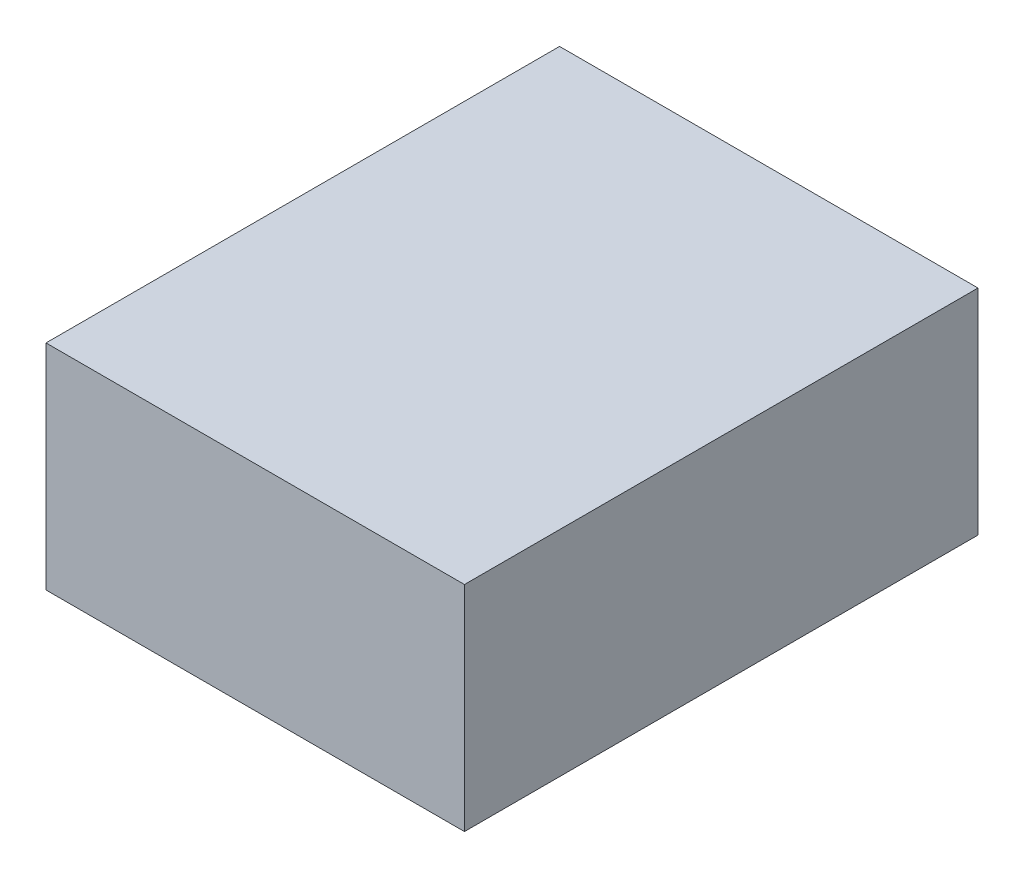
ISO-10303-21;
HEADER;
FILE_DESCRIPTION(('STEP AP214'),'2;1');
FILE_NAME('part.step','',(''),(''),'','','');
FILE_SCHEMA(('AUTOMOTIVE_DESIGN { 1 0 10303 214 1 1 1 1 }'));
ENDSEC;
DATA;
#1=APPLICATION_CONTEXT('core data for automotive mechanical design processes');
#2=APPLICATION_PROTOCOL_DEFINITION('international standard','automotive_design',2000,#1);
#3=PRODUCT_CONTEXT('',#1,'mechanical');
#4=PRODUCT('Part','Part','',(#3));
#5=PRODUCT_RELATED_PRODUCT_CATEGORY('part','',(#4));
#6=PRODUCT_DEFINITION_FORMATION('','',#4);
#7=PRODUCT_DEFINITION_CONTEXT('part definition',#1,'design');
#8=PRODUCT_DEFINITION('design','',#6,#7);
#9=PRODUCT_DEFINITION_SHAPE('','',#8);
#10=(LENGTH_UNIT() NAMED_UNIT(*) SI_UNIT(.MILLI.,.METRE.));
#11=(NAMED_UNIT(*) PLANE_ANGLE_UNIT() SI_UNIT($,.RADIAN.));
#12=(NAMED_UNIT(*) SI_UNIT($,.STERADIAN.) SOLID_ANGLE_UNIT());
#13=UNCERTAINTY_MEASURE_WITH_UNIT(LENGTH_MEASURE(1.E-05),#10,'distance_accuracy_value','');
#14=(GEOMETRIC_REPRESENTATION_CONTEXT(3) GLOBAL_UNCERTAINTY_ASSIGNED_CONTEXT((#13)) GLOBAL_UNIT_ASSIGNED_CONTEXT((#10,
#11,#12)) REPRESENTATION_CONTEXT('',''));
#15=CARTESIAN_POINT('',(0.,0.,0.));
#16=DIRECTION('',(0.,0.,1.));
#17=DIRECTION('',(1.,0.,0.));
#18=AXIS2_PLACEMENT_3D('',#15,#16,#17);
#19=CARTESIAN_POINT('',(352.,-90.,-216.));
#20=DIRECTION('',(0.,0.,1.));
#21=DIRECTION('',(1.,0.,0.));
#22=AXIS2_PLACEMENT_3D('',#19,#20,#21);
#23=PLANE('',#22);
#24=DIRECTION('',(0.,1.,0.));
#25=VECTOR('',#24,1.);
#26=CARTESIAN_POINT('',(0.,-90.,-216.));
#27=LINE('',#26,#25);
#28=CARTESIAN_POINT('',(0.,-90.,-216.));
#29=VERTEX_POINT('',#28);
#30=CARTESIAN_POINT('',(0.,90.,-216.));
#31=VERTEX_POINT('',#30);
#32=EDGE_CURVE('E102',#29,#31,#27,.T.);
#33=ORIENTED_EDGE('',*,*,#32,.T.);
#34=DIRECTION('',(-1.,0.,0.));
#35=VECTOR('',#34,1.);
#36=CARTESIAN_POINT('',(352.,90.,-216.));
#37=LINE('',#36,#35);
#38=CARTESIAN_POINT('',(352.,90.,-216.));
#39=VERTEX_POINT('',#38);
#40=EDGE_CURVE('E11',#39,#31,#37,.T.);
#41=ORIENTED_EDGE('',*,*,#40,.F.);
#42=DIRECTION('',(0.,1.,0.));
#43=VECTOR('',#42,1.);
#44=CARTESIAN_POINT('',(352.,-90.,-216.));
#45=LINE('',#44,#43);
#46=CARTESIAN_POINT('',(352.,-90.,-216.));
#47=VERTEX_POINT('',#46);
#48=EDGE_CURVE('E90',#47,#39,#45,.T.);
#49=ORIENTED_EDGE('',*,*,#48,.F.);
#50=DIRECTION('',(-1.,0.,0.));
#51=VECTOR('',#50,1.);
#52=CARTESIAN_POINT('',(352.,-90.,-216.));
#53=LINE('',#52,#51);
#54=EDGE_CURVE('E98',#47,#29,#53,.T.);
#55=ORIENTED_EDGE('',*,*,#54,.T.);
#56=EDGE_LOOP('',(#33,#41,#49,#55));
#57=FACE_BOUND('',#56,.T.);
#58=ADVANCED_FACE('F39',(#57),#23,.F.);
#59=CARTESIAN_POINT('',(352.,90.,216.));
#60=DIRECTION('',(0.,-1.,0.));
#61=DIRECTION('',(0.,0.,-1.));
#62=AXIS2_PLACEMENT_3D('',#59,#60,#61);
#63=PLANE('',#62);
#64=DIRECTION('',(0.,0.,1.));
#65=VECTOR('',#64,1.);
#66=CARTESIAN_POINT('',(0.,90.,216.));
#67=LINE('',#66,#65);
#68=CARTESIAN_POINT('',(0.,90.,216.));
#69=VERTEX_POINT('',#68);
#70=EDGE_CURVE('E94',#31,#69,#67,.T.);
#71=ORIENTED_EDGE('',*,*,#70,.T.);
#72=DIRECTION('',(-1.,0.,0.));
#73=VECTOR('',#72,1.);
#74=CARTESIAN_POINT('',(352.,90.,216.));
#75=LINE('',#74,#73);
#76=CARTESIAN_POINT('',(352.,90.,216.));
#77=VERTEX_POINT('',#76);
#78=EDGE_CURVE('E47',#77,#69,#75,.T.);
#79=ORIENTED_EDGE('',*,*,#78,.F.);
#80=DIRECTION('',(0.,0.,1.));
#81=VECTOR('',#80,1.);
#82=CARTESIAN_POINT('',(352.,90.,216.));
#83=LINE('',#82,#81);
#84=EDGE_CURVE('E85',#39,#77,#83,.T.);
#85=ORIENTED_EDGE('',*,*,#84,.F.);
#86=ORIENTED_EDGE('',*,*,#40,.T.);
#87=EDGE_LOOP('',(#71,#79,#85,#86));
#88=FACE_BOUND('',#87,.T.);
#89=ADVANCED_FACE('F93',(#88),#63,.F.);
#90=CARTESIAN_POINT('',(352.,-90.,216.));
#91=DIRECTION('',(0.,0.,-1.));
#92=DIRECTION('',(-1.,0.,0.));
#93=AXIS2_PLACEMENT_3D('',#90,#91,#92);
#94=PLANE('',#93);
#95=DIRECTION('',(0.,-1.,0.));
#96=VECTOR('',#95,1.);
#97=CARTESIAN_POINT('',(0.,-90.,216.));
#98=LINE('',#97,#96);
#99=CARTESIAN_POINT('',(0.,-90.,216.));
#100=VERTEX_POINT('',#99);
#101=EDGE_CURVE('E72',#69,#100,#98,.T.);
#102=ORIENTED_EDGE('',*,*,#101,.T.);
#103=DIRECTION('',(-1.,0.,0.));
#104=VECTOR('',#103,1.);
#105=CARTESIAN_POINT('',(352.,-90.,216.));
#106=LINE('',#105,#104);
#107=CARTESIAN_POINT('',(352.,-90.,216.));
#108=VERTEX_POINT('',#107);
#109=EDGE_CURVE('E95',#108,#100,#106,.T.);
#110=ORIENTED_EDGE('',*,*,#109,.F.);
#111=DIRECTION('',(0.,-1.,0.));
#112=VECTOR('',#111,1.);
#113=CARTESIAN_POINT('',(352.,-90.,216.));
#114=LINE('',#113,#112);
#115=EDGE_CURVE('E88',#77,#108,#114,.T.);
#116=ORIENTED_EDGE('',*,*,#115,.F.);
#117=ORIENTED_EDGE('',*,*,#78,.T.);
#118=EDGE_LOOP('',(#102,#110,#116,#117));
#119=FACE_BOUND('',#118,.T.);
#120=ADVANCED_FACE('F96',(#119),#94,.F.);
#121=CARTESIAN_POINT('',(352.,-90.,216.));
#122=DIRECTION('',(0.,1.,0.));
#123=DIRECTION('',(0.,0.,1.));
#124=AXIS2_PLACEMENT_3D('',#121,#122,#123);
#125=PLANE('',#124);
#126=DIRECTION('',(0.,0.,-1.));
#127=VECTOR('',#126,1.);
#128=CARTESIAN_POINT('',(0.,-90.,216.));
#129=LINE('',#128,#127);
#130=EDGE_CURVE('E78',#100,#29,#129,.T.);
#131=ORIENTED_EDGE('',*,*,#130,.T.);
#132=ORIENTED_EDGE('',*,*,#54,.F.);
#133=DIRECTION('',(0.,0.,-1.));
#134=VECTOR('',#133,1.);
#135=CARTESIAN_POINT('',(352.,-90.,216.));
#136=LINE('',#135,#134);
#137=EDGE_CURVE('E55',#108,#47,#136,.T.);
#138=ORIENTED_EDGE('',*,*,#137,.F.);
#139=ORIENTED_EDGE('',*,*,#109,.T.);
#140=EDGE_LOOP('',(#131,#132,#138,#139));
#141=FACE_BOUND('',#140,.T.);
#142=ADVANCED_FACE('F109',(#141),#125,.F.);
#143=CARTESIAN_POINT('',(352.,0.,0.));
#144=DIRECTION('',(-1.,0.,0.));
#145=DIRECTION('',(0.,0.,1.));
#146=AXIS2_PLACEMENT_3D('',#143,#144,#145);
#147=PLANE('',#146);
#148=ORIENTED_EDGE('',*,*,#48,.T.);
#149=ORIENTED_EDGE('',*,*,#84,.T.);
#150=ORIENTED_EDGE('',*,*,#115,.T.);
#151=ORIENTED_EDGE('',*,*,#137,.T.);
#152=EDGE_LOOP('',(#148,#149,#150,#151));
#153=FACE_BOUND('',#152,.T.);
#154=ADVANCED_FACE('F86',(#153),#147,.F.);
#155=CARTESIAN_POINT('',(0.,0.,0.));
#156=DIRECTION('',(-1.,0.,0.));
#157=DIRECTION('',(0.,0.,1.));
#158=AXIS2_PLACEMENT_3D('',#155,#156,#157);
#159=PLANE('',#158);
#160=ORIENTED_EDGE('',*,*,#32,.F.);
#161=ORIENTED_EDGE('',*,*,#130,.F.);
#162=ORIENTED_EDGE('',*,*,#101,.F.);
#163=ORIENTED_EDGE('',*,*,#70,.F.);
#164=EDGE_LOOP('',(#160,#161,#162,#163));
#165=FACE_BOUND('',#164,.T.);
#166=ADVANCED_FACE('F112',(#165),#159,.T.);
#167=CLOSED_SHELL('',(#58,#89,#120,#142,#154,#166));
#168=MANIFOLD_SOLID_BREP('B2',#167);
#169=ADVANCED_BREP_SHAPE_REPRESENTATION('',(#18,#168),#14);
#170=SHAPE_DEFINITION_REPRESENTATION(#9,#169);
ENDSEC;
END-ISO-10303-21;
